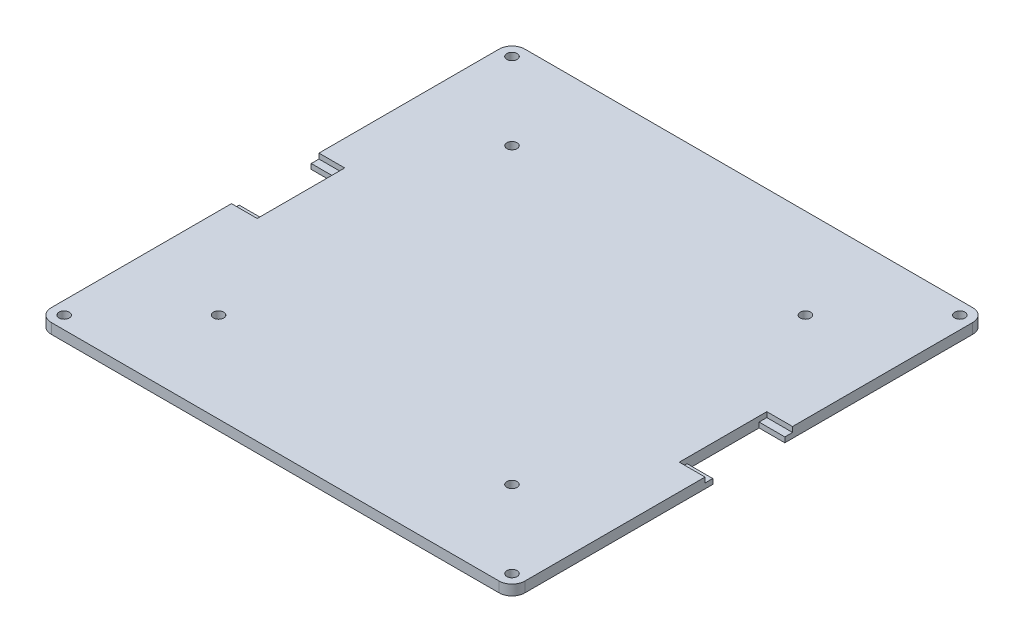
ISO-10303-21;
HEADER;
FILE_DESCRIPTION(('STEP AP214'),'2;1');
FILE_NAME('part.step','',(''),(''),'','','');
FILE_SCHEMA(('AUTOMOTIVE_DESIGN { 1 0 10303 214 1 1 1 1 }'));
ENDSEC;
DATA;
#1=APPLICATION_CONTEXT('core data for automotive mechanical design processes');
#2=APPLICATION_PROTOCOL_DEFINITION('international standard','automotive_design',2000,#1);
#3=PRODUCT_CONTEXT('',#1,'mechanical');
#4=PRODUCT('Part','Part','',(#3));
#5=PRODUCT_RELATED_PRODUCT_CATEGORY('part','',(#4));
#6=PRODUCT_DEFINITION_FORMATION('','',#4);
#7=PRODUCT_DEFINITION_CONTEXT('part definition',#1,'design');
#8=PRODUCT_DEFINITION('design','',#6,#7);
#9=PRODUCT_DEFINITION_SHAPE('','',#8);
#10=(LENGTH_UNIT() NAMED_UNIT(*) SI_UNIT(.MILLI.,.METRE.));
#11=(NAMED_UNIT(*) PLANE_ANGLE_UNIT() SI_UNIT($,.RADIAN.));
#12=(NAMED_UNIT(*) SI_UNIT($,.STERADIAN.) SOLID_ANGLE_UNIT());
#13=UNCERTAINTY_MEASURE_WITH_UNIT(LENGTH_MEASURE(1.E-05),#10,'distance_accuracy_value','');
#14=(GEOMETRIC_REPRESENTATION_CONTEXT(3) GLOBAL_UNCERTAINTY_ASSIGNED_CONTEXT((#13)) GLOBAL_UNIT_ASSIGNED_CONTEXT((#10,
#11,#12)) REPRESENTATION_CONTEXT('',''));
#15=CARTESIAN_POINT('',(0.,0.,0.));
#16=DIRECTION('',(0.,0.,1.));
#17=DIRECTION('',(1.,0.,0.));
#18=AXIS2_PLACEMENT_3D('',#15,#16,#17);
#19=CARTESIAN_POINT('',(-46.,-8.,-6.99999999999999));
#20=DIRECTION('',(0.,0.,-1.));
#21=DIRECTION('',(-1.,0.,0.));
#22=AXIS2_PLACEMENT_3D('',#19,#20,#21);
#23=PLANE('',#22);
#24=DIRECTION('',(-1.,0.,0.));
#25=VECTOR('',#24,1.);
#26=CARTESIAN_POINT('',(-41.,-9.,-6.99999999999999));
#27=LINE('',#26,#25);
#28=CARTESIAN_POINT('',(-41.,-9.,-6.99999999999999));
#29=VERTEX_POINT('',#28);
#30=CARTESIAN_POINT('',(-46.,-9.,-6.99999999999999));
#31=VERTEX_POINT('',#30);
#32=EDGE_CURVE('E271',#29,#31,#27,.T.);
#33=ORIENTED_EDGE('',*,*,#32,.T.);
#34=DIRECTION('',(0.,-1.,0.));
#35=VECTOR('',#34,1.);
#36=CARTESIAN_POINT('',(-46.,-8.,-6.99999999999999));
#37=LINE('',#36,#35);
#38=CARTESIAN_POINT('',(-46.,-10.,-6.99999999999999));
#39=VERTEX_POINT('',#38);
#40=EDGE_CURVE('E12',#31,#39,#37,.T.);
#41=ORIENTED_EDGE('',*,*,#40,.T.);
#42=DIRECTION('',(1.,0.,0.));
#43=VECTOR('',#42,1.);
#44=CARTESIAN_POINT('',(-46.,-10.,-6.99999999999999));
#45=LINE('',#44,#43);
#46=CARTESIAN_POINT('',(-41.,-10.,-6.99999999999999));
#47=VERTEX_POINT('',#46);
#48=EDGE_CURVE('E313',#39,#47,#45,.T.);
#49=ORIENTED_EDGE('',*,*,#48,.T.);
#50=DIRECTION('',(0.,-1.,0.));
#51=VECTOR('',#50,1.);
#52=CARTESIAN_POINT('',(-41.,-8.,-6.99999999999999));
#53=LINE('',#52,#51);
#54=EDGE_CURVE('E50',#29,#47,#53,.T.);
#55=ORIENTED_EDGE('',*,*,#54,.F.);
#56=EDGE_LOOP('',(#33,#41,#49,#55));
#57=FACE_BOUND('',#56,.T.);
#58=ADVANCED_FACE('F41',(#57),#23,.F.);
#59=CARTESIAN_POINT('',(-41.,-8.,7.00000000000001));
#60=DIRECTION('',(0.,0.,1.));
#61=DIRECTION('',(1.,0.,0.));
#62=AXIS2_PLACEMENT_3D('',#59,#60,#61);
#63=PLANE('',#62);
#64=DIRECTION('',(1.,0.,0.));
#65=VECTOR('',#64,1.);
#66=CARTESIAN_POINT('',(-41.,-9.,7.00000000000001));
#67=LINE('',#66,#65);
#68=CARTESIAN_POINT('',(-46.,-9.,7.00000000000001));
#69=VERTEX_POINT('',#68);
#70=CARTESIAN_POINT('',(-41.,-9.,7.00000000000001));
#71=VERTEX_POINT('',#70);
#72=EDGE_CURVE('E214',#69,#71,#67,.T.);
#73=ORIENTED_EDGE('',*,*,#72,.T.);
#74=DIRECTION('',(0.,-1.,0.));
#75=VECTOR('',#74,1.);
#76=CARTESIAN_POINT('',(-41.,-8.,7.00000000000001));
#77=LINE('',#76,#75);
#78=CARTESIAN_POINT('',(-41.,-10.,7.00000000000001));
#79=VERTEX_POINT('',#78);
#80=EDGE_CURVE('E210',#71,#79,#77,.T.);
#81=ORIENTED_EDGE('',*,*,#80,.T.);
#82=DIRECTION('',(-1.,0.,0.));
#83=VECTOR('',#82,1.);
#84=CARTESIAN_POINT('',(-41.,-10.,7.00000000000001));
#85=LINE('',#84,#83);
#86=CARTESIAN_POINT('',(-46.,-10.,7.00000000000001));
#87=VERTEX_POINT('',#86);
#88=EDGE_CURVE('E318',#79,#87,#85,.T.);
#89=ORIENTED_EDGE('',*,*,#88,.T.);
#90=DIRECTION('',(0.,-1.,0.));
#91=VECTOR('',#90,1.);
#92=CARTESIAN_POINT('',(-46.,-8.,7.00000000000001));
#93=LINE('',#92,#91);
#94=EDGE_CURVE('E379',#69,#87,#93,.T.);
#95=ORIENTED_EDGE('',*,*,#94,.F.);
#96=EDGE_LOOP('',(#73,#81,#89,#95));
#97=FACE_BOUND('',#96,.T.);
#98=ADVANCED_FACE('F424',(#97),#63,.F.);
#99=CARTESIAN_POINT('',(41.,-8.,7.00000000000001));
#100=DIRECTION('',(0.,0.,1.));
#101=DIRECTION('',(1.,0.,0.));
#102=AXIS2_PLACEMENT_3D('',#99,#100,#101);
#103=PLANE('',#102);
#104=DIRECTION('',(1.,0.,0.));
#105=VECTOR('',#104,1.);
#106=CARTESIAN_POINT('',(41.,-9.,7.00000000000001));
#107=LINE('',#106,#105);
#108=CARTESIAN_POINT('',(41.,-9.,7.00000000000001));
#109=VERTEX_POINT('',#108);
#110=CARTESIAN_POINT('',(46.,-9.,7.00000000000001));
#111=VERTEX_POINT('',#110);
#112=EDGE_CURVE('E247',#109,#111,#107,.T.);
#113=ORIENTED_EDGE('',*,*,#112,.T.);
#114=DIRECTION('',(0.,-1.,0.));
#115=VECTOR('',#114,1.);
#116=CARTESIAN_POINT('',(46.,-8.,7.00000000000001));
#117=LINE('',#116,#115);
#118=CARTESIAN_POINT('',(46.,-10.,7.00000000000001));
#119=VERTEX_POINT('',#118);
#120=EDGE_CURVE('E365',#111,#119,#117,.T.);
#121=ORIENTED_EDGE('',*,*,#120,.T.);
#122=DIRECTION('',(-1.,0.,0.));
#123=VECTOR('',#122,1.);
#124=CARTESIAN_POINT('',(41.,-10.,7.00000000000001));
#125=LINE('',#124,#123);
#126=CARTESIAN_POINT('',(41.,-10.,7.00000000000001));
#127=VERTEX_POINT('',#126);
#128=EDGE_CURVE('E332',#119,#127,#125,.T.);
#129=ORIENTED_EDGE('',*,*,#128,.T.);
#130=DIRECTION('',(0.,-1.,0.));
#131=VECTOR('',#130,1.);
#132=CARTESIAN_POINT('',(41.,-8.,7.00000000000001));
#133=LINE('',#132,#131);
#134=EDGE_CURVE('E363',#109,#127,#133,.T.);
#135=ORIENTED_EDGE('',*,*,#134,.F.);
#136=EDGE_LOOP('',(#113,#121,#129,#135));
#137=FACE_BOUND('',#136,.T.);
#138=ADVANCED_FACE('F430',(#137),#103,.F.);
#139=CARTESIAN_POINT('',(46.,-8.,-6.99999999999999));
#140=DIRECTION('',(0.,0.,-1.));
#141=DIRECTION('',(-1.,0.,0.));
#142=AXIS2_PLACEMENT_3D('',#139,#140,#141);
#143=PLANE('',#142);
#144=DIRECTION('',(-1.,0.,0.));
#145=VECTOR('',#144,1.);
#146=CARTESIAN_POINT('',(41.,-9.,-6.99999999999999));
#147=LINE('',#146,#145);
#148=CARTESIAN_POINT('',(46.,-9.,-6.99999999999999));
#149=VERTEX_POINT('',#148);
#150=CARTESIAN_POINT('',(41.,-9.,-6.99999999999999));
#151=VERTEX_POINT('',#150);
#152=EDGE_CURVE('E252',#149,#151,#147,.T.);
#153=ORIENTED_EDGE('',*,*,#152,.T.);
#154=DIRECTION('',(0.,-1.,0.));
#155=VECTOR('',#154,1.);
#156=CARTESIAN_POINT('',(41.,-8.,-6.99999999999999));
#157=LINE('',#156,#155);
#158=CARTESIAN_POINT('',(41.,-10.,-6.99999999999999));
#159=VERTEX_POINT('',#158);
#160=EDGE_CURVE('E361',#151,#159,#157,.T.);
#161=ORIENTED_EDGE('',*,*,#160,.T.);
#162=DIRECTION('',(1.,0.,0.));
#163=VECTOR('',#162,1.);
#164=CARTESIAN_POINT('',(46.,-10.,-6.99999999999999));
#165=LINE('',#164,#163);
#166=CARTESIAN_POINT('',(46.,-10.,-6.99999999999999));
#167=VERTEX_POINT('',#166);
#168=EDGE_CURVE('E338',#159,#167,#165,.T.);
#169=ORIENTED_EDGE('',*,*,#168,.T.);
#170=DIRECTION('',(0.,-1.,0.));
#171=VECTOR('',#170,1.);
#172=CARTESIAN_POINT('',(46.,-8.,-6.99999999999999));
#173=LINE('',#172,#171);
#174=EDGE_CURVE('E359',#149,#167,#173,.T.);
#175=ORIENTED_EDGE('',*,*,#174,.F.);
#176=EDGE_LOOP('',(#153,#161,#169,#175));
#177=FACE_BOUND('',#176,.T.);
#178=ADVANCED_FACE('F459',(#177),#143,.F.);
#179=CARTESIAN_POINT('',(-46.,-8.,-43.5));
#180=DIRECTION('',(1.,0.,0.));
#181=DIRECTION('',(0.,0.,-1.));
#182=AXIS2_PLACEMENT_3D('',#179,#180,#181);
#183=PLANE('',#182);
#184=DIRECTION('',(0.,0.,-1.));
#185=VECTOR('',#184,1.);
#186=CARTESIAN_POINT('',(-46.,-9.,-6.99999999999999));
#187=LINE('',#186,#185);
#188=CARTESIAN_POINT('',(-46.,-9.,-8.49999999999999));
#189=VERTEX_POINT('',#188);
#190=EDGE_CURVE('E268',#31,#189,#187,.T.);
#191=ORIENTED_EDGE('',*,*,#190,.T.);
#192=DIRECTION('',(0.,1.,0.));
#193=VECTOR('',#192,1.);
#194=CARTESIAN_POINT('',(-46.,-15.2201532544553,-8.49999999999999));
#195=LINE('',#194,#193);
#196=CARTESIAN_POINT('',(-46.,-8.,-8.49999999999999));
#197=VERTEX_POINT('',#196);
#198=EDGE_CURVE('E272',#189,#197,#195,.T.);
#199=ORIENTED_EDGE('',*,*,#198,.T.);
#200=DIRECTION('',(0.,0.,1.));
#201=VECTOR('',#200,1.);
#202=CARTESIAN_POINT('',(-46.,-8.,-43.5));
#203=LINE('',#202,#201);
#204=CARTESIAN_POINT('',(-46.,-8.,-43.5));
#205=VERTEX_POINT('',#204);
#206=EDGE_CURVE('E285',#205,#197,#203,.T.);
#207=ORIENTED_EDGE('',*,*,#206,.F.);
#208=DIRECTION('',(0.,-1.,0.));
#209=VECTOR('',#208,1.);
#210=CARTESIAN_POINT('',(-46.,-8.,-43.5));
#211=LINE('',#210,#209);
#212=CARTESIAN_POINT('',(-46.,-10.,-43.5));
#213=VERTEX_POINT('',#212);
#214=EDGE_CURVE('E310',#205,#213,#211,.T.);
#215=ORIENTED_EDGE('',*,*,#214,.T.);
#216=DIRECTION('',(0.,0.,1.));
#217=VECTOR('',#216,1.);
#218=CARTESIAN_POINT('',(-46.,-10.,-43.5));
#219=LINE('',#218,#217);
#220=EDGE_CURVE('E284',#213,#39,#219,.T.);
#221=ORIENTED_EDGE('',*,*,#220,.T.);
#222=ORIENTED_EDGE('',*,*,#40,.F.);
#223=EDGE_LOOP('',(#191,#199,#207,#215,#221,#222));
#224=FACE_BOUND('',#223,.T.);
#225=ADVANCED_FACE('F43',(#224),#183,.F.);
#226=CARTESIAN_POINT('',(-41.,-8.,-6.99999999999999));
#227=DIRECTION('',(1.,0.,0.));
#228=DIRECTION('',(0.,0.,-1.));
#229=AXIS2_PLACEMENT_3D('',#226,#227,#228);
#230=PLANE('',#229);
#231=DIRECTION('',(0.,0.,1.));
#232=VECTOR('',#231,1.);
#233=CARTESIAN_POINT('',(-41.,-10.,-6.99999999999999));
#234=LINE('',#233,#232);
#235=EDGE_CURVE('E316',#47,#79,#234,.T.);
#236=ORIENTED_EDGE('',*,*,#235,.T.);
#237=ORIENTED_EDGE('',*,*,#80,.F.);
#238=DIRECTION('',(0.,0.,1.));
#239=VECTOR('',#238,1.);
#240=CARTESIAN_POINT('',(-41.,-9.,7.00000000000001));
#241=LINE('',#240,#239);
#242=CARTESIAN_POINT('',(-41.,-9.,8.50000000000001));
#243=VERTEX_POINT('',#242);
#244=EDGE_CURVE('E203',#71,#243,#241,.T.);
#245=ORIENTED_EDGE('',*,*,#244,.T.);
#246=DIRECTION('',(0.,1.,0.));
#247=VECTOR('',#246,1.);
#248=CARTESIAN_POINT('',(-41.,-15.2201532544553,8.50000000000001));
#249=LINE('',#248,#247);
#250=CARTESIAN_POINT('',(-41.,-8.,8.50000000000001));
#251=VERTEX_POINT('',#250);
#252=EDGE_CURVE('E208',#243,#251,#249,.T.);
#253=ORIENTED_EDGE('',*,*,#252,.T.);
#254=DIRECTION('',(0.,0.,1.));
#255=VECTOR('',#254,1.);
#256=CARTESIAN_POINT('',(-41.,-8.,-6.99999999999999));
#257=LINE('',#256,#255);
#258=CARTESIAN_POINT('',(-41.,-8.,-8.49999999999999));
#259=VERTEX_POINT('',#258);
#260=EDGE_CURVE('E66',#259,#251,#257,.T.);
#261=ORIENTED_EDGE('',*,*,#260,.F.);
#262=DIRECTION('',(0.,1.,0.));
#263=VECTOR('',#262,1.);
#264=CARTESIAN_POINT('',(-41.,-15.2201532544553,-8.49999999999999));
#265=LINE('',#264,#263);
#266=CARTESIAN_POINT('',(-41.,-9.,-8.49999999999999));
#267=VERTEX_POINT('',#266);
#268=EDGE_CURVE('E279',#267,#259,#265,.T.);
#269=ORIENTED_EDGE('',*,*,#268,.F.);
#270=DIRECTION('',(0.,0.,1.));
#271=VECTOR('',#270,1.);
#272=CARTESIAN_POINT('',(-41.,-9.,-6.99999999999999));
#273=LINE('',#272,#271);
#274=EDGE_CURVE('E275',#267,#29,#273,.T.);
#275=ORIENTED_EDGE('',*,*,#274,.T.);
#276=ORIENTED_EDGE('',*,*,#54,.T.);
#277=EDGE_LOOP('',(#236,#237,#245,#253,#261,#269,#275,#276));
#278=FACE_BOUND('',#277,.T.);
#279=ADVANCED_FACE('F206',(#278),#230,.F.);
#280=CARTESIAN_POINT('',(-46.,-8.,7.00000000000001));
#281=DIRECTION('',(1.,0.,0.));
#282=DIRECTION('',(0.,0.,-1.));
#283=AXIS2_PLACEMENT_3D('',#280,#281,#282);
#284=PLANE('',#283);
#285=DIRECTION('',(0.,0.,1.));
#286=VECTOR('',#285,1.);
#287=CARTESIAN_POINT('',(-46.,-8.,7.00000000000001));
#288=LINE('',#287,#286);
#289=CARTESIAN_POINT('',(-46.,-8.,8.50000000000001));
#290=VERTEX_POINT('',#289);
#291=CARTESIAN_POINT('',(-46.,-8.,43.5));
#292=VERTEX_POINT('',#291);
#293=EDGE_CURVE('E290',#290,#292,#288,.T.);
#294=ORIENTED_EDGE('',*,*,#293,.F.);
#295=DIRECTION('',(0.,1.,0.));
#296=VECTOR('',#295,1.);
#297=CARTESIAN_POINT('',(-46.,-15.2201532544553,8.50000000000001));
#298=LINE('',#297,#296);
#299=CARTESIAN_POINT('',(-46.,-9.,8.50000000000001));
#300=VERTEX_POINT('',#299);
#301=EDGE_CURVE('E226',#300,#290,#298,.T.);
#302=ORIENTED_EDGE('',*,*,#301,.F.);
#303=DIRECTION('',(0.,0.,-1.));
#304=VECTOR('',#303,1.);
#305=CARTESIAN_POINT('',(-46.,-9.,7.00000000000001));
#306=LINE('',#305,#304);
#307=EDGE_CURVE('E219',#300,#69,#306,.T.);
#308=ORIENTED_EDGE('',*,*,#307,.T.);
#309=ORIENTED_EDGE('',*,*,#94,.T.);
#310=DIRECTION('',(0.,0.,1.));
#311=VECTOR('',#310,1.);
#312=CARTESIAN_POINT('',(-46.,-10.,7.00000000000001));
#313=LINE('',#312,#311);
#314=CARTESIAN_POINT('',(-46.,-10.,43.5));
#315=VERTEX_POINT('',#314);
#316=EDGE_CURVE('E321',#87,#315,#313,.T.);
#317=ORIENTED_EDGE('',*,*,#316,.T.);
#318=DIRECTION('',(0.,-1.,0.));
#319=VECTOR('',#318,1.);
#320=CARTESIAN_POINT('',(-46.,-8.,43.5));
#321=LINE('',#320,#319);
#322=EDGE_CURVE('E376',#292,#315,#321,.T.);
#323=ORIENTED_EDGE('',*,*,#322,.F.);
#324=EDGE_LOOP('',(#294,#302,#308,#309,#317,#323));
#325=FACE_BOUND('',#324,.T.);
#326=ADVANCED_FACE('F435',(#325),#284,.F.);
#327=CARTESIAN_POINT('',(-43.5,-8.,43.5));
#328=DIRECTION('',(0.,-1.,0.));
#329=DIRECTION('',(0.,0.,-1.));
#330=AXIS2_PLACEMENT_3D('',#327,#328,#329);
#331=CYLINDRICAL_SURFACE('',#330,2.50000000000001);
#332=CARTESIAN_POINT('',(-43.5,-10.,43.5));
#333=DIRECTION('',(0.,1.,0.));
#334=DIRECTION('',(0.,0.,1.));
#335=AXIS2_PLACEMENT_3D('',#332,#333,#334);
#336=CIRCLE('',#335,2.50000000000001);
#337=CARTESIAN_POINT('',(-43.5,-10.,46.));
#338=VERTEX_POINT('',#337);
#339=EDGE_CURVE('E323',#315,#338,#336,.T.);
#340=ORIENTED_EDGE('',*,*,#339,.T.);
#341=DIRECTION('',(0.,-1.,0.));
#342=VECTOR('',#341,1.);
#343=CARTESIAN_POINT('',(-43.5,-8.,46.));
#344=LINE('',#343,#342);
#345=CARTESIAN_POINT('',(-43.5,-8.,46.));
#346=VERTEX_POINT('',#345);
#347=EDGE_CURVE('E373',#346,#338,#344,.T.);
#348=ORIENTED_EDGE('',*,*,#347,.F.);
#349=CARTESIAN_POINT('',(-43.5,-8.,43.5));
#350=DIRECTION('',(0.,1.,0.));
#351=DIRECTION('',(0.,0.,1.));
#352=AXIS2_PLACEMENT_3D('',#349,#350,#351);
#353=CIRCLE('',#352,2.50000000000001);
#354=EDGE_CURVE('E292',#292,#346,#353,.T.);
#355=ORIENTED_EDGE('',*,*,#354,.F.);
#356=ORIENTED_EDGE('',*,*,#322,.T.);
#357=EDGE_LOOP('',(#340,#348,#355,#356));
#358=FACE_BOUND('',#357,.T.);
#359=ADVANCED_FACE('F439',(#358),#331,.T.);
#360=CARTESIAN_POINT('',(-43.5,-8.,46.));
#361=DIRECTION('',(0.,0.,-1.));
#362=DIRECTION('',(-1.,0.,0.));
#363=AXIS2_PLACEMENT_3D('',#360,#361,#362);
#364=PLANE('',#363);
#365=DIRECTION('',(1.,0.,0.));
#366=VECTOR('',#365,1.);
#367=CARTESIAN_POINT('',(-43.5,-10.,46.));
#368=LINE('',#367,#366);
#369=CARTESIAN_POINT('',(43.5,-10.,46.));
#370=VERTEX_POINT('',#369);
#371=EDGE_CURVE('E325',#338,#370,#368,.T.);
#372=ORIENTED_EDGE('',*,*,#371,.T.);
#373=DIRECTION('',(0.,-1.,0.));
#374=VECTOR('',#373,1.);
#375=CARTESIAN_POINT('',(43.5,-8.,46.));
#376=LINE('',#375,#374);
#377=CARTESIAN_POINT('',(43.5,-8.,46.));
#378=VERTEX_POINT('',#377);
#379=EDGE_CURVE('E370',#378,#370,#376,.T.);
#380=ORIENTED_EDGE('',*,*,#379,.F.);
#381=DIRECTION('',(1.,0.,0.));
#382=VECTOR('',#381,1.);
#383=CARTESIAN_POINT('',(-43.5,-8.,46.));
#384=LINE('',#383,#382);
#385=EDGE_CURVE('E294',#346,#378,#384,.T.);
#386=ORIENTED_EDGE('',*,*,#385,.F.);
#387=ORIENTED_EDGE('',*,*,#347,.T.);
#388=EDGE_LOOP('',(#372,#380,#386,#387));
#389=FACE_BOUND('',#388,.T.);
#390=ADVANCED_FACE('F443',(#389),#364,.F.);
#391=CARTESIAN_POINT('',(43.5,-8.,43.5));
#392=DIRECTION('',(0.,-1.,0.));
#393=DIRECTION('',(0.,0.,-1.));
#394=AXIS2_PLACEMENT_3D('',#391,#392,#393);
#395=CYLINDRICAL_SURFACE('',#394,2.5);
#396=CARTESIAN_POINT('',(43.5,-10.,43.5));
#397=DIRECTION('',(0.,1.,0.));
#398=DIRECTION('',(0.,0.,1.));
#399=AXIS2_PLACEMENT_3D('',#396,#397,#398);
#400=CIRCLE('',#399,2.5);
#401=CARTESIAN_POINT('',(46.,-10.,43.5));
#402=VERTEX_POINT('',#401);
#403=EDGE_CURVE('E327',#370,#402,#400,.T.);
#404=ORIENTED_EDGE('',*,*,#403,.T.);
#405=DIRECTION('',(0.,-1.,0.));
#406=VECTOR('',#405,1.);
#407=CARTESIAN_POINT('',(46.,-8.,43.5));
#408=LINE('',#407,#406);
#409=CARTESIAN_POINT('',(46.,-8.,43.5));
#410=VERTEX_POINT('',#409);
#411=EDGE_CURVE('E367',#410,#402,#408,.T.);
#412=ORIENTED_EDGE('',*,*,#411,.F.);
#413=CARTESIAN_POINT('',(43.5,-8.,43.5));
#414=DIRECTION('',(0.,1.,0.));
#415=DIRECTION('',(0.,0.,1.));
#416=AXIS2_PLACEMENT_3D('',#413,#414,#415);
#417=CIRCLE('',#416,2.5);
#418=EDGE_CURVE('E296',#378,#410,#417,.T.);
#419=ORIENTED_EDGE('',*,*,#418,.F.);
#420=ORIENTED_EDGE('',*,*,#379,.T.);
#421=EDGE_LOOP('',(#404,#412,#419,#420));
#422=FACE_BOUND('',#421,.T.);
#423=ADVANCED_FACE('F447',(#422),#395,.T.);
#424=CARTESIAN_POINT('',(46.,-8.,43.5));
#425=DIRECTION('',(-1.,0.,0.));
#426=DIRECTION('',(0.,0.,1.));
#427=AXIS2_PLACEMENT_3D('',#424,#425,#426);
#428=PLANE('',#427);
#429=DIRECTION('',(0.,0.,1.));
#430=VECTOR('',#429,1.);
#431=CARTESIAN_POINT('',(46.,-9.,7.00000000000001));
#432=LINE('',#431,#430);
#433=CARTESIAN_POINT('',(46.,-9.,8.50000000000001));
#434=VERTEX_POINT('',#433);
#435=EDGE_CURVE('E244',#111,#434,#432,.T.);
#436=ORIENTED_EDGE('',*,*,#435,.T.);
#437=DIRECTION('',(0.,1.,0.));
#438=VECTOR('',#437,1.);
#439=CARTESIAN_POINT('',(46.,-15.2201532544553,8.50000000000001));
#440=LINE('',#439,#438);
#441=CARTESIAN_POINT('',(46.,-8.,8.50000000000001));
#442=VERTEX_POINT('',#441);
#443=EDGE_CURVE('E241',#434,#442,#440,.T.);
#444=ORIENTED_EDGE('',*,*,#443,.T.);
#445=DIRECTION('',(0.,0.,-1.));
#446=VECTOR('',#445,1.);
#447=CARTESIAN_POINT('',(46.,-8.,43.5));
#448=LINE('',#447,#446);
#449=EDGE_CURVE('E298',#410,#442,#448,.T.);
#450=ORIENTED_EDGE('',*,*,#449,.F.);
#451=ORIENTED_EDGE('',*,*,#411,.T.);
#452=DIRECTION('',(0.,0.,-1.));
#453=VECTOR('',#452,1.);
#454=CARTESIAN_POINT('',(46.,-10.,43.5));
#455=LINE('',#454,#453);
#456=EDGE_CURVE('E329',#402,#119,#455,.T.);
#457=ORIENTED_EDGE('',*,*,#456,.T.);
#458=ORIENTED_EDGE('',*,*,#120,.F.);
#459=EDGE_LOOP('',(#436,#444,#450,#451,#457,#458));
#460=FACE_BOUND('',#459,.T.);
#461=ADVANCED_FACE('F451',(#460),#428,.F.);
#462=CARTESIAN_POINT('',(41.,-8.,-6.99999999999999));
#463=DIRECTION('',(-1.,0.,0.));
#464=DIRECTION('',(0.,0.,1.));
#465=AXIS2_PLACEMENT_3D('',#462,#463,#464);
#466=PLANE('',#465);
#467=DIRECTION('',(0.,0.,-1.));
#468=VECTOR('',#467,1.);
#469=CARTESIAN_POINT('',(41.,-10.,-6.99999999999999));
#470=LINE('',#469,#468);
#471=EDGE_CURVE('E335',#127,#159,#470,.T.);
#472=ORIENTED_EDGE('',*,*,#471,.T.);
#473=ORIENTED_EDGE('',*,*,#160,.F.);
#474=DIRECTION('',(0.,0.,-1.));
#475=VECTOR('',#474,1.);
#476=CARTESIAN_POINT('',(41.,-9.,-6.99999999999999));
#477=LINE('',#476,#475);
#478=CARTESIAN_POINT('',(41.,-9.,-8.49999999999999));
#479=VERTEX_POINT('',#478);
#480=EDGE_CURVE('E255',#151,#479,#477,.T.);
#481=ORIENTED_EDGE('',*,*,#480,.T.);
#482=DIRECTION('',(0.,1.,0.));
#483=VECTOR('',#482,1.);
#484=CARTESIAN_POINT('',(41.,-15.2201532544553,-8.49999999999999));
#485=LINE('',#484,#483);
#486=CARTESIAN_POINT('',(41.,-8.,-8.49999999999999));
#487=VERTEX_POINT('',#486);
#488=EDGE_CURVE('E258',#479,#487,#485,.T.);
#489=ORIENTED_EDGE('',*,*,#488,.T.);
#490=DIRECTION('',(0.,0.,-1.));
#491=VECTOR('',#490,1.);
#492=CARTESIAN_POINT('',(41.,-8.,-6.99999999999999));
#493=LINE('',#492,#491);
#494=CARTESIAN_POINT('',(41.,-8.,8.50000000000001));
#495=VERTEX_POINT('',#494);
#496=EDGE_CURVE('E58',#495,#487,#493,.T.);
#497=ORIENTED_EDGE('',*,*,#496,.F.);
#498=DIRECTION('',(0.,1.,0.));
#499=VECTOR('',#498,1.);
#500=CARTESIAN_POINT('',(41.,-15.2201532544553,8.50000000000001));
#501=LINE('',#500,#499);
#502=CARTESIAN_POINT('',(41.,-9.,8.50000000000001));
#503=VERTEX_POINT('',#502);
#504=EDGE_CURVE('E238',#503,#495,#501,.T.);
#505=ORIENTED_EDGE('',*,*,#504,.F.);
#506=DIRECTION('',(0.,0.,-1.));
#507=VECTOR('',#506,1.);
#508=CARTESIAN_POINT('',(41.,-9.,7.00000000000001));
#509=LINE('',#508,#507);
#510=EDGE_CURVE('E236',#503,#109,#509,.T.);
#511=ORIENTED_EDGE('',*,*,#510,.T.);
#512=ORIENTED_EDGE('',*,*,#134,.T.);
#513=EDGE_LOOP('',(#472,#473,#481,#489,#497,#505,#511,#512));
#514=FACE_BOUND('',#513,.T.);
#515=ADVANCED_FACE('F455',(#514),#466,.F.);
#516=CARTESIAN_POINT('',(46.,-8.,-6.99999999999999));
#517=DIRECTION('',(-1.,0.,0.));
#518=DIRECTION('',(0.,0.,1.));
#519=AXIS2_PLACEMENT_3D('',#516,#517,#518);
#520=PLANE('',#519);
#521=DIRECTION('',(0.,0.,-1.));
#522=VECTOR('',#521,1.);
#523=CARTESIAN_POINT('',(46.,-8.,-6.99999999999999));
#524=LINE('',#523,#522);
#525=CARTESIAN_POINT('',(46.,-8.,-8.49999999999999));
#526=VERTEX_POINT('',#525);
#527=CARTESIAN_POINT('',(46.,-8.,-43.5));
#528=VERTEX_POINT('',#527);
#529=EDGE_CURVE('E302',#526,#528,#524,.T.);
#530=ORIENTED_EDGE('',*,*,#529,.F.);
#531=DIRECTION('',(0.,1.,0.));
#532=VECTOR('',#531,1.);
#533=CARTESIAN_POINT('',(46.,-15.2201532544553,-8.49999999999999));
#534=LINE('',#533,#532);
#535=CARTESIAN_POINT('',(46.,-9.,-8.49999999999999));
#536=VERTEX_POINT('',#535);
#537=EDGE_CURVE('E256',#536,#526,#534,.T.);
#538=ORIENTED_EDGE('',*,*,#537,.F.);
#539=DIRECTION('',(0.,0.,1.));
#540=VECTOR('',#539,1.);
#541=CARTESIAN_POINT('',(46.,-9.,-6.99999999999999));
#542=LINE('',#541,#540);
#543=EDGE_CURVE('E260',#536,#149,#542,.T.);
#544=ORIENTED_EDGE('',*,*,#543,.T.);
#545=ORIENTED_EDGE('',*,*,#174,.T.);
#546=DIRECTION('',(0.,0.,-1.));
#547=VECTOR('',#546,1.);
#548=CARTESIAN_POINT('',(46.,-10.,-6.99999999999999));
#549=LINE('',#548,#547);
#550=CARTESIAN_POINT('',(46.,-10.,-43.5));
#551=VERTEX_POINT('',#550);
#552=EDGE_CURVE('E341',#167,#551,#549,.T.);
#553=ORIENTED_EDGE('',*,*,#552,.T.);
#554=DIRECTION('',(0.,-1.,0.));
#555=VECTOR('',#554,1.);
#556=CARTESIAN_POINT('',(46.,-8.,-43.5));
#557=LINE('',#556,#555);
#558=EDGE_CURVE('E356',#528,#551,#557,.T.);
#559=ORIENTED_EDGE('',*,*,#558,.F.);
#560=EDGE_LOOP('',(#530,#538,#544,#545,#553,#559));
#561=FACE_BOUND('',#560,.T.);
#562=ADVANCED_FACE('F463',(#561),#520,.F.);
#563=CARTESIAN_POINT('',(43.5,-8.,-43.5));
#564=DIRECTION('',(0.,-1.,0.));
#565=DIRECTION('',(0.,0.,-1.));
#566=AXIS2_PLACEMENT_3D('',#563,#564,#565);
#567=CYLINDRICAL_SURFACE('',#566,2.49999999999999);
#568=CARTESIAN_POINT('',(43.5,-10.,-43.5));
#569=DIRECTION('',(0.,1.,0.));
#570=DIRECTION('',(0.,0.,1.));
#571=AXIS2_PLACEMENT_3D('',#568,#569,#570);
#572=CIRCLE('',#571,2.49999999999999);
#573=CARTESIAN_POINT('',(43.5,-10.,-46.));
#574=VERTEX_POINT('',#573);
#575=EDGE_CURVE('E343',#551,#574,#572,.T.);
#576=ORIENTED_EDGE('',*,*,#575,.T.);
#577=DIRECTION('',(0.,-1.,0.));
#578=VECTOR('',#577,1.);
#579=CARTESIAN_POINT('',(43.5,-8.,-46.));
#580=LINE('',#579,#578);
#581=CARTESIAN_POINT('',(43.5,-8.,-46.));
#582=VERTEX_POINT('',#581);
#583=EDGE_CURVE('E353',#582,#574,#580,.T.);
#584=ORIENTED_EDGE('',*,*,#583,.F.);
#585=CARTESIAN_POINT('',(43.5,-8.,-43.5));
#586=DIRECTION('',(0.,1.,0.));
#587=DIRECTION('',(0.,0.,1.));
#588=AXIS2_PLACEMENT_3D('',#585,#586,#587);
#589=CIRCLE('',#588,2.49999999999999);
#590=EDGE_CURVE('E304',#528,#582,#589,.T.);
#591=ORIENTED_EDGE('',*,*,#590,.F.);
#592=ORIENTED_EDGE('',*,*,#558,.T.);
#593=EDGE_LOOP('',(#576,#584,#591,#592));
#594=FACE_BOUND('',#593,.T.);
#595=ADVANCED_FACE('F469',(#594),#567,.T.);
#596=CARTESIAN_POINT('',(43.5,-8.,-46.));
#597=DIRECTION('',(0.,0.,1.));
#598=DIRECTION('',(1.,0.,0.));
#599=AXIS2_PLACEMENT_3D('',#596,#597,#598);
#600=PLANE('',#599);
#601=DIRECTION('',(-1.,0.,0.));
#602=VECTOR('',#601,1.);
#603=CARTESIAN_POINT('',(43.5,-10.,-46.));
#604=LINE('',#603,#602);
#605=CARTESIAN_POINT('',(-43.5,-10.,-46.));
#606=VERTEX_POINT('',#605);
#607=EDGE_CURVE('E345',#574,#606,#604,.T.);
#608=ORIENTED_EDGE('',*,*,#607,.T.);
#609=DIRECTION('',(0.,-1.,0.));
#610=VECTOR('',#609,1.);
#611=CARTESIAN_POINT('',(-43.5,-8.,-46.));
#612=LINE('',#611,#610);
#613=CARTESIAN_POINT('',(-43.5,-8.,-46.));
#614=VERTEX_POINT('',#613);
#615=EDGE_CURVE('E350',#614,#606,#612,.T.);
#616=ORIENTED_EDGE('',*,*,#615,.F.);
#617=DIRECTION('',(-1.,0.,0.));
#618=VECTOR('',#617,1.);
#619=CARTESIAN_POINT('',(43.5,-8.,-46.));
#620=LINE('',#619,#618);
#621=EDGE_CURVE('E306',#582,#614,#620,.T.);
#622=ORIENTED_EDGE('',*,*,#621,.F.);
#623=ORIENTED_EDGE('',*,*,#583,.T.);
#624=EDGE_LOOP('',(#608,#616,#622,#623));
#625=FACE_BOUND('',#624,.T.);
#626=ADVANCED_FACE('F473',(#625),#600,.F.);
#627=CARTESIAN_POINT('',(-43.5,-8.,-43.5));
#628=DIRECTION('',(0.,-1.,0.));
#629=DIRECTION('',(0.,0.,-1.));
#630=AXIS2_PLACEMENT_3D('',#627,#628,#629);
#631=CYLINDRICAL_SURFACE('',#630,2.50000000000001);
#632=CARTESIAN_POINT('',(-43.5,-10.,-43.5));
#633=DIRECTION('',(0.,1.,0.));
#634=DIRECTION('',(0.,0.,1.));
#635=AXIS2_PLACEMENT_3D('',#632,#633,#634);
#636=CIRCLE('',#635,2.50000000000001);
#637=EDGE_CURVE('E288',#606,#213,#636,.T.);
#638=ORIENTED_EDGE('',*,*,#637,.T.);
#639=ORIENTED_EDGE('',*,*,#214,.F.);
#640=CARTESIAN_POINT('',(-43.5,-8.,-43.5));
#641=DIRECTION('',(0.,1.,0.));
#642=DIRECTION('',(0.,0.,1.));
#643=AXIS2_PLACEMENT_3D('',#640,#641,#642);
#644=CIRCLE('',#643,2.50000000000001);
#645=EDGE_CURVE('E308',#614,#205,#644,.T.);
#646=ORIENTED_EDGE('',*,*,#645,.F.);
#647=ORIENTED_EDGE('',*,*,#615,.T.);
#648=EDGE_LOOP('',(#638,#639,#646,#647));
#649=FACE_BOUND('',#648,.T.);
#650=ADVANCED_FACE('F477',(#649),#631,.T.);
#651=CARTESIAN_POINT('',(-43.5,-8.,43.5));
#652=DIRECTION('',(0.,1.,0.));
#653=DIRECTION('',(0.,0.,1.));
#654=AXIS2_PLACEMENT_3D('',#651,#652,#653);
#655=PLANE('',#654);
#656=CARTESIAN_POINT('',(-28.5,-8.,-28.5));
#657=DIRECTION('',(0.,1.,0.));
#658=DIRECTION('',(0.,0.,1.));
#659=AXIS2_PLACEMENT_3D('',#656,#657,#658);
#660=CIRCLE('',#659,1.);
#661=CARTESIAN_POINT('',(-28.5,-8.,-27.5));
#662=VERTEX_POINT('',#661);
#663=EDGE_CURVE('E611',#662,#662,#660,.T.);
#664=ORIENTED_EDGE('',*,*,#663,.F.);
#665=EDGE_LOOP('',(#664));
#666=FACE_BOUND('',#665,.T.);
#667=CARTESIAN_POINT('',(43.5,-8.,43.5));
#668=DIRECTION('',(0.,1.,0.));
#669=DIRECTION('',(0.,0.,1.));
#670=AXIS2_PLACEMENT_3D('',#667,#668,#669);
#671=CIRCLE('',#670,0.999999999999998);
#672=CARTESIAN_POINT('',(43.5,-8.,44.5));
#673=VERTEX_POINT('',#672);
#674=EDGE_CURVE('E609',#673,#673,#671,.T.);
#675=ORIENTED_EDGE('',*,*,#674,.F.);
#676=EDGE_LOOP('',(#675));
#677=FACE_BOUND('',#676,.T.);
#678=CARTESIAN_POINT('',(-43.5,-8.,43.5));
#679=DIRECTION('',(0.,1.,0.));
#680=DIRECTION('',(0.,0.,1.));
#681=AXIS2_PLACEMENT_3D('',#678,#679,#680);
#682=CIRCLE('',#681,0.999999999999998);
#683=CARTESIAN_POINT('',(-43.5,-8.,44.5));
#684=VERTEX_POINT('',#683);
#685=EDGE_CURVE('E606',#684,#684,#682,.T.);
#686=ORIENTED_EDGE('',*,*,#685,.F.);
#687=EDGE_LOOP('',(#686));
#688=FACE_BOUND('',#687,.T.);
#689=CARTESIAN_POINT('',(43.5,-8.,-43.5));
#690=DIRECTION('',(0.,1.,0.));
#691=DIRECTION('',(0.,0.,1.));
#692=AXIS2_PLACEMENT_3D('',#689,#690,#691);
#693=CIRCLE('',#692,0.999999999999998);
#694=CARTESIAN_POINT('',(43.5,-8.,-42.5));
#695=VERTEX_POINT('',#694);
#696=EDGE_CURVE('E535',#695,#695,#693,.T.);
#697=ORIENTED_EDGE('',*,*,#696,.F.);
#698=EDGE_LOOP('',(#697));
#699=FACE_BOUND('',#698,.T.);
#700=CARTESIAN_POINT('',(28.5,-8.,28.5));
#701=DIRECTION('',(0.,1.,0.));
#702=DIRECTION('',(0.,0.,1.));
#703=AXIS2_PLACEMENT_3D('',#700,#701,#702);
#704=CIRCLE('',#703,1.);
#705=CARTESIAN_POINT('',(28.5,-8.,29.5));
#706=VERTEX_POINT('',#705);
#707=EDGE_CURVE('E619',#706,#706,#704,.T.);
#708=ORIENTED_EDGE('',*,*,#707,.F.);
#709=EDGE_LOOP('',(#708));
#710=FACE_BOUND('',#709,.T.);
#711=CARTESIAN_POINT('',(-28.5,-8.,28.5));
#712=DIRECTION('',(0.,1.,0.));
#713=DIRECTION('',(0.,0.,1.));
#714=AXIS2_PLACEMENT_3D('',#711,#712,#713);
#715=CIRCLE('',#714,1.);
#716=CARTESIAN_POINT('',(-28.5,-8.,29.5));
#717=VERTEX_POINT('',#716);
#718=EDGE_CURVE('E616',#717,#717,#715,.T.);
#719=ORIENTED_EDGE('',*,*,#718,.F.);
#720=EDGE_LOOP('',(#719));
#721=FACE_BOUND('',#720,.T.);
#722=CARTESIAN_POINT('',(28.5,-8.,-28.5));
#723=DIRECTION('',(0.,1.,0.));
#724=DIRECTION('',(0.,0.,1.));
#725=AXIS2_PLACEMENT_3D('',#722,#723,#724);
#726=CIRCLE('',#725,1.);
#727=CARTESIAN_POINT('',(28.5,-8.,-27.5));
#728=VERTEX_POINT('',#727);
#729=EDGE_CURVE('E613',#728,#728,#726,.T.);
#730=ORIENTED_EDGE('',*,*,#729,.F.);
#731=EDGE_LOOP('',(#730));
#732=FACE_BOUND('',#731,.T.);
#733=CARTESIAN_POINT('',(-43.5,-8.,-43.5));
#734=DIRECTION('',(0.,1.,0.));
#735=DIRECTION('',(0.,0.,1.));
#736=AXIS2_PLACEMENT_3D('',#733,#734,#735);
#737=CIRCLE('',#736,0.999999999999998);
#738=CARTESIAN_POINT('',(-43.5,-8.,-42.5));
#739=VERTEX_POINT('',#738);
#740=EDGE_CURVE('E387',#739,#739,#737,.T.);
#741=ORIENTED_EDGE('',*,*,#740,.F.);
#742=EDGE_LOOP('',(#741));
#743=FACE_BOUND('',#742,.T.);
#744=ORIENTED_EDGE('',*,*,#496,.T.);
#745=DIRECTION('',(-1.,0.,0.));
#746=VECTOR('',#745,1.);
#747=CARTESIAN_POINT('',(41.,-8.,-8.49999999999999));
#748=LINE('',#747,#746);
#749=EDGE_CURVE('E237',#526,#487,#748,.T.);
#750=ORIENTED_EDGE('',*,*,#749,.F.);
#751=ORIENTED_EDGE('',*,*,#529,.T.);
#752=ORIENTED_EDGE('',*,*,#590,.T.);
#753=ORIENTED_EDGE('',*,*,#621,.T.);
#754=ORIENTED_EDGE('',*,*,#645,.T.);
#755=ORIENTED_EDGE('',*,*,#206,.T.);
#756=DIRECTION('',(-1.,0.,0.));
#757=VECTOR('',#756,1.);
#758=CARTESIAN_POINT('',(-41.,-8.,-8.49999999999999));
#759=LINE('',#758,#757);
#760=EDGE_CURVE('E232',#259,#197,#759,.T.);
#761=ORIENTED_EDGE('',*,*,#760,.F.);
#762=ORIENTED_EDGE('',*,*,#260,.T.);
#763=DIRECTION('',(1.,0.,0.));
#764=VECTOR('',#763,1.);
#765=CARTESIAN_POINT('',(-41.,-8.,8.50000000000001));
#766=LINE('',#765,#764);
#767=EDGE_CURVE('E225',#290,#251,#766,.T.);
#768=ORIENTED_EDGE('',*,*,#767,.F.);
#769=ORIENTED_EDGE('',*,*,#293,.T.);
#770=ORIENTED_EDGE('',*,*,#354,.T.);
#771=ORIENTED_EDGE('',*,*,#385,.T.);
#772=ORIENTED_EDGE('',*,*,#418,.T.);
#773=ORIENTED_EDGE('',*,*,#449,.T.);
#774=DIRECTION('',(1.,0.,0.));
#775=VECTOR('',#774,1.);
#776=CARTESIAN_POINT('',(41.,-8.,8.50000000000001));
#777=LINE('',#776,#775);
#778=EDGE_CURVE('E240',#495,#442,#777,.T.);
#779=ORIENTED_EDGE('',*,*,#778,.F.);
#780=EDGE_LOOP('',(#744,#750,#751,#752,#753,#754,#755,#761,#762,#768,#769,#770,#771,#772,#773,#779));
#781=FACE_BOUND('',#780,.T.);
#782=ADVANCED_FACE('F480',(#666,#677,#688,#699,#710,#721,#732,#743,#781),#655,.T.);
#783=CARTESIAN_POINT('',(-43.5,-10.,43.5));
#784=DIRECTION('',(0.,1.,0.));
#785=DIRECTION('',(0.,0.,1.));
#786=AXIS2_PLACEMENT_3D('',#783,#784,#785);
#787=PLANE('',#786);
#788=CARTESIAN_POINT('',(-28.5,-10.,-28.5));
#789=DIRECTION('',(0.,1.,0.));
#790=DIRECTION('',(0.,0.,1.));
#791=AXIS2_PLACEMENT_3D('',#788,#789,#790);
#792=CIRCLE('',#791,1.);
#793=CARTESIAN_POINT('',(-28.5,-10.,-27.5));
#794=VERTEX_POINT('',#793);
#795=EDGE_CURVE('E45',#794,#794,#792,.T.);
#796=ORIENTED_EDGE('',*,*,#795,.T.);
#797=EDGE_LOOP('',(#796));
#798=FACE_BOUND('',#797,.T.);
#799=CARTESIAN_POINT('',(43.5,-10.,43.5));
#800=DIRECTION('',(0.,1.,0.));
#801=DIRECTION('',(0.,0.,1.));
#802=AXIS2_PLACEMENT_3D('',#799,#800,#801);
#803=CIRCLE('',#802,0.999999999999998);
#804=CARTESIAN_POINT('',(43.5,-10.,44.5));
#805=VERTEX_POINT('',#804);
#806=EDGE_CURVE('E401',#805,#805,#803,.T.);
#807=ORIENTED_EDGE('',*,*,#806,.T.);
#808=EDGE_LOOP('',(#807));
#809=FACE_BOUND('',#808,.T.);
#810=CARTESIAN_POINT('',(-43.5,-10.,43.5));
#811=DIRECTION('',(0.,1.,0.));
#812=DIRECTION('',(0.,0.,1.));
#813=AXIS2_PLACEMENT_3D('',#810,#811,#812);
#814=CIRCLE('',#813,0.999999999999998);
#815=CARTESIAN_POINT('',(-43.5,-10.,44.5));
#816=VERTEX_POINT('',#815);
#817=EDGE_CURVE('E399',#816,#816,#814,.T.);
#818=ORIENTED_EDGE('',*,*,#817,.T.);
#819=EDGE_LOOP('',(#818));
#820=FACE_BOUND('',#819,.T.);
#821=CARTESIAN_POINT('',(43.5,-10.,-43.5));
#822=DIRECTION('',(0.,1.,0.));
#823=DIRECTION('',(0.,0.,1.));
#824=AXIS2_PLACEMENT_3D('',#821,#822,#823);
#825=CIRCLE('',#824,0.999999999999998);
#826=CARTESIAN_POINT('',(43.5,-10.,-42.5));
#827=VERTEX_POINT('',#826);
#828=EDGE_CURVE('E396',#827,#827,#825,.T.);
#829=ORIENTED_EDGE('',*,*,#828,.T.);
#830=EDGE_LOOP('',(#829));
#831=FACE_BOUND('',#830,.T.);
#832=CARTESIAN_POINT('',(28.5,-10.,28.5));
#833=DIRECTION('',(0.,1.,0.));
#834=DIRECTION('',(0.,0.,1.));
#835=AXIS2_PLACEMENT_3D('',#832,#833,#834);
#836=CIRCLE('',#835,1.);
#837=CARTESIAN_POINT('',(28.5,-10.,29.5));
#838=VERTEX_POINT('',#837);
#839=EDGE_CURVE('E393',#838,#838,#836,.T.);
#840=ORIENTED_EDGE('',*,*,#839,.T.);
#841=EDGE_LOOP('',(#840));
#842=FACE_BOUND('',#841,.T.);
#843=CARTESIAN_POINT('',(-28.5,-10.,28.5));
#844=DIRECTION('',(0.,1.,0.));
#845=DIRECTION('',(0.,0.,1.));
#846=AXIS2_PLACEMENT_3D('',#843,#844,#845);
#847=CIRCLE('',#846,1.);
#848=CARTESIAN_POINT('',(-28.5,-10.,29.5));
#849=VERTEX_POINT('',#848);
#850=EDGE_CURVE('E390',#849,#849,#847,.T.);
#851=ORIENTED_EDGE('',*,*,#850,.T.);
#852=EDGE_LOOP('',(#851));
#853=FACE_BOUND('',#852,.T.);
#854=CARTESIAN_POINT('',(28.5,-10.,-28.5));
#855=DIRECTION('',(0.,1.,0.));
#856=DIRECTION('',(0.,0.,1.));
#857=AXIS2_PLACEMENT_3D('',#854,#855,#856);
#858=CIRCLE('',#857,1.);
#859=CARTESIAN_POINT('',(28.5,-10.,-27.5));
#860=VERTEX_POINT('',#859);
#861=EDGE_CURVE('E386',#860,#860,#858,.T.);
#862=ORIENTED_EDGE('',*,*,#861,.T.);
#863=EDGE_LOOP('',(#862));
#864=FACE_BOUND('',#863,.T.);
#865=CARTESIAN_POINT('',(-43.5,-10.,-43.5));
#866=DIRECTION('',(0.,1.,0.));
#867=DIRECTION('',(0.,0.,1.));
#868=AXIS2_PLACEMENT_3D('',#865,#866,#867);
#869=CIRCLE('',#868,0.999999999999998);
#870=CARTESIAN_POINT('',(-43.5,-10.,-42.5));
#871=VERTEX_POINT('',#870);
#872=EDGE_CURVE('E383',#871,#871,#869,.T.);
#873=ORIENTED_EDGE('',*,*,#872,.T.);
#874=EDGE_LOOP('',(#873));
#875=FACE_BOUND('',#874,.T.);
#876=ORIENTED_EDGE('',*,*,#220,.F.);
#877=ORIENTED_EDGE('',*,*,#637,.F.);
#878=ORIENTED_EDGE('',*,*,#607,.F.);
#879=ORIENTED_EDGE('',*,*,#575,.F.);
#880=ORIENTED_EDGE('',*,*,#552,.F.);
#881=ORIENTED_EDGE('',*,*,#168,.F.);
#882=ORIENTED_EDGE('',*,*,#471,.F.);
#883=ORIENTED_EDGE('',*,*,#128,.F.);
#884=ORIENTED_EDGE('',*,*,#456,.F.);
#885=ORIENTED_EDGE('',*,*,#403,.F.);
#886=ORIENTED_EDGE('',*,*,#371,.F.);
#887=ORIENTED_EDGE('',*,*,#339,.F.);
#888=ORIENTED_EDGE('',*,*,#316,.F.);
#889=ORIENTED_EDGE('',*,*,#88,.F.);
#890=ORIENTED_EDGE('',*,*,#235,.F.);
#891=ORIENTED_EDGE('',*,*,#48,.F.);
#892=EDGE_LOOP('',(#876,#877,#878,#879,#880,#881,#882,#883,#884,#885,#886,#887,#888,#889,#890,#891));
#893=FACE_BOUND('',#892,.T.);
#894=ADVANCED_FACE('F408',(#798,#809,#820,#831,#842,#853,#864,#875,#893),#787,.F.);
#895=CARTESIAN_POINT('',(-41.,-15.2201532544553,-8.49999999999999));
#896=DIRECTION('',(0.,0.,-1.));
#897=DIRECTION('',(-1.,0.,0.));
#898=AXIS2_PLACEMENT_3D('',#895,#896,#897);
#899=PLANE('',#898);
#900=DIRECTION('',(1.,0.,0.));
#901=VECTOR('',#900,1.);
#902=CARTESIAN_POINT('',(-41.,-9.,-8.49999999999999));
#903=LINE('',#902,#901);
#904=EDGE_CURVE('E277',#189,#267,#903,.T.);
#905=ORIENTED_EDGE('',*,*,#904,.T.);
#906=ORIENTED_EDGE('',*,*,#268,.T.);
#907=ORIENTED_EDGE('',*,*,#760,.T.);
#908=ORIENTED_EDGE('',*,*,#198,.F.);
#909=EDGE_LOOP('',(#905,#906,#907,#908));
#910=FACE_BOUND('',#909,.T.);
#911=ADVANCED_FACE('F484',(#910),#899,.F.);
#912=CARTESIAN_POINT('',(-43.5,-9.,43.5));
#913=DIRECTION('',(0.,1.,0.));
#914=DIRECTION('',(0.,0.,1.));
#915=AXIS2_PLACEMENT_3D('',#912,#913,#914);
#916=PLANE('',#915);
#917=ORIENTED_EDGE('',*,*,#274,.F.);
#918=ORIENTED_EDGE('',*,*,#904,.F.);
#919=ORIENTED_EDGE('',*,*,#190,.F.);
#920=ORIENTED_EDGE('',*,*,#32,.F.);
#921=EDGE_LOOP('',(#917,#918,#919,#920));
#922=FACE_BOUND('',#921,.T.);
#923=ADVANCED_FACE('F490',(#922),#916,.T.);
#924=CARTESIAN_POINT('',(-41.,-15.2201532544553,8.50000000000001));
#925=DIRECTION('',(0.,0.,1.));
#926=DIRECTION('',(1.,0.,0.));
#927=AXIS2_PLACEMENT_3D('',#924,#925,#926);
#928=PLANE('',#927);
#929=DIRECTION('',(-1.,0.,0.));
#930=VECTOR('',#929,1.);
#931=CARTESIAN_POINT('',(-41.,-9.,8.50000000000001));
#932=LINE('',#931,#930);
#933=EDGE_CURVE('E213',#243,#300,#932,.T.);
#934=ORIENTED_EDGE('',*,*,#933,.T.);
#935=ORIENTED_EDGE('',*,*,#301,.T.);
#936=ORIENTED_EDGE('',*,*,#767,.T.);
#937=ORIENTED_EDGE('',*,*,#252,.F.);
#938=EDGE_LOOP('',(#934,#935,#936,#937));
#939=FACE_BOUND('',#938,.T.);
#940=ADVANCED_FACE('F223',(#939),#928,.F.);
#941=CARTESIAN_POINT('',(-43.5,-9.,43.5));
#942=DIRECTION('',(0.,1.,0.));
#943=DIRECTION('',(0.,0.,1.));
#944=AXIS2_PLACEMENT_3D('',#941,#942,#943);
#945=PLANE('',#944);
#946=ORIENTED_EDGE('',*,*,#244,.F.);
#947=ORIENTED_EDGE('',*,*,#72,.F.);
#948=ORIENTED_EDGE('',*,*,#307,.F.);
#949=ORIENTED_EDGE('',*,*,#933,.F.);
#950=EDGE_LOOP('',(#946,#947,#948,#949));
#951=FACE_BOUND('',#950,.T.);
#952=ADVANCED_FACE('F217',(#951),#945,.T.);
#953=CARTESIAN_POINT('',(41.,-15.2201532544553,8.50000000000001));
#954=DIRECTION('',(0.,0.,1.));
#955=DIRECTION('',(1.,0.,0.));
#956=AXIS2_PLACEMENT_3D('',#953,#954,#955);
#957=PLANE('',#956);
#958=DIRECTION('',(-1.,0.,0.));
#959=VECTOR('',#958,1.);
#960=CARTESIAN_POINT('',(41.,-9.,8.50000000000001));
#961=LINE('',#960,#959);
#962=EDGE_CURVE('E234',#434,#503,#961,.T.);
#963=ORIENTED_EDGE('',*,*,#962,.T.);
#964=ORIENTED_EDGE('',*,*,#504,.T.);
#965=ORIENTED_EDGE('',*,*,#778,.T.);
#966=ORIENTED_EDGE('',*,*,#443,.F.);
#967=EDGE_LOOP('',(#963,#964,#965,#966));
#968=FACE_BOUND('',#967,.T.);
#969=ADVANCED_FACE('F507',(#968),#957,.F.);
#970=CARTESIAN_POINT('',(-43.5,-9.,43.5));
#971=DIRECTION('',(0.,1.,0.));
#972=DIRECTION('',(0.,0.,1.));
#973=AXIS2_PLACEMENT_3D('',#970,#971,#972);
#974=PLANE('',#973);
#975=ORIENTED_EDGE('',*,*,#510,.F.);
#976=ORIENTED_EDGE('',*,*,#962,.F.);
#977=ORIENTED_EDGE('',*,*,#435,.F.);
#978=ORIENTED_EDGE('',*,*,#112,.F.);
#979=EDGE_LOOP('',(#975,#976,#977,#978));
#980=FACE_BOUND('',#979,.T.);
#981=ADVANCED_FACE('F503',(#980),#974,.T.);
#982=CARTESIAN_POINT('',(41.,-15.2201532544553,-8.49999999999999));
#983=DIRECTION('',(0.,0.,-1.));
#984=DIRECTION('',(-1.,0.,0.));
#985=AXIS2_PLACEMENT_3D('',#982,#983,#984);
#986=PLANE('',#985);
#987=DIRECTION('',(1.,0.,0.));
#988=VECTOR('',#987,1.);
#989=CARTESIAN_POINT('',(41.,-9.,-8.49999999999999));
#990=LINE('',#989,#988);
#991=EDGE_CURVE('E264',#479,#536,#990,.T.);
#992=ORIENTED_EDGE('',*,*,#991,.T.);
#993=ORIENTED_EDGE('',*,*,#537,.T.);
#994=ORIENTED_EDGE('',*,*,#749,.T.);
#995=ORIENTED_EDGE('',*,*,#488,.F.);
#996=EDGE_LOOP('',(#992,#993,#994,#995));
#997=FACE_BOUND('',#996,.T.);
#998=ADVANCED_FACE('F499',(#997),#986,.F.);
#999=CARTESIAN_POINT('',(-43.5,-9.,43.5));
#1000=DIRECTION('',(0.,1.,0.));
#1001=DIRECTION('',(0.,0.,1.));
#1002=AXIS2_PLACEMENT_3D('',#999,#1000,#1001);
#1003=PLANE('',#1002);
#1004=ORIENTED_EDGE('',*,*,#480,.F.);
#1005=ORIENTED_EDGE('',*,*,#152,.F.);
#1006=ORIENTED_EDGE('',*,*,#543,.F.);
#1007=ORIENTED_EDGE('',*,*,#991,.F.);
#1008=EDGE_LOOP('',(#1004,#1005,#1006,#1007));
#1009=FACE_BOUND('',#1008,.T.);
#1010=ADVANCED_FACE('F495',(#1009),#1003,.T.);
#1011=CARTESIAN_POINT('',(-43.5,-13.,-43.5));
#1012=DIRECTION('',(0.,1.,0.));
#1013=DIRECTION('',(0.,0.,1.));
#1014=AXIS2_PLACEMENT_3D('',#1011,#1012,#1013);
#1015=CYLINDRICAL_SURFACE('',#1014,0.999999999999998);
#1016=ORIENTED_EDGE('',*,*,#740,.T.);
#1017=EDGE_LOOP('',(#1016));
#1018=FACE_BOUND('',#1017,.T.);
#1019=ORIENTED_EDGE('',*,*,#872,.F.);
#1020=EDGE_LOOP('',(#1019));
#1021=FACE_BOUND('',#1020,.T.);
#1022=ADVANCED_FACE('F498',(#1018,#1021),#1015,.F.);
#1023=CARTESIAN_POINT('',(28.5,-13.,-28.5));
#1024=DIRECTION('',(0.,1.,0.));
#1025=DIRECTION('',(0.,0.,1.));
#1026=AXIS2_PLACEMENT_3D('',#1023,#1024,#1025);
#1027=CYLINDRICAL_SURFACE('',#1026,1.);
#1028=ORIENTED_EDGE('',*,*,#729,.T.);
#1029=EDGE_LOOP('',(#1028));
#1030=FACE_BOUND('',#1029,.T.);
#1031=ORIENTED_EDGE('',*,*,#861,.F.);
#1032=EDGE_LOOP('',(#1031));
#1033=FACE_BOUND('',#1032,.T.);
#1034=ADVANCED_FACE('F518',(#1030,#1033),#1027,.F.);
#1035=CARTESIAN_POINT('',(-28.5,-13.,28.5));
#1036=DIRECTION('',(0.,1.,0.));
#1037=DIRECTION('',(0.,0.,1.));
#1038=AXIS2_PLACEMENT_3D('',#1035,#1036,#1037);
#1039=CYLINDRICAL_SURFACE('',#1038,1.);
#1040=ORIENTED_EDGE('',*,*,#718,.T.);
#1041=EDGE_LOOP('',(#1040));
#1042=FACE_BOUND('',#1041,.T.);
#1043=ORIENTED_EDGE('',*,*,#850,.F.);
#1044=EDGE_LOOP('',(#1043));
#1045=FACE_BOUND('',#1044,.T.);
#1046=ADVANCED_FACE('F529',(#1042,#1045),#1039,.F.);
#1047=CARTESIAN_POINT('',(28.5,-13.,28.5));
#1048=DIRECTION('',(0.,1.,0.));
#1049=DIRECTION('',(0.,0.,1.));
#1050=AXIS2_PLACEMENT_3D('',#1047,#1048,#1049);
#1051=CYLINDRICAL_SURFACE('',#1050,1.);
#1052=ORIENTED_EDGE('',*,*,#707,.T.);
#1053=EDGE_LOOP('',(#1052));
#1054=FACE_BOUND('',#1053,.T.);
#1055=ORIENTED_EDGE('',*,*,#839,.F.);
#1056=EDGE_LOOP('',(#1055));
#1057=FACE_BOUND('',#1056,.T.);
#1058=ADVANCED_FACE('F524',(#1054,#1057),#1051,.F.);
#1059=CARTESIAN_POINT('',(43.5,-13.,-43.5));
#1060=DIRECTION('',(0.,1.,0.));
#1061=DIRECTION('',(0.,0.,1.));
#1062=AXIS2_PLACEMENT_3D('',#1059,#1060,#1061);
#1063=CYLINDRICAL_SURFACE('',#1062,0.999999999999998);
#1064=ORIENTED_EDGE('',*,*,#696,.T.);
#1065=EDGE_LOOP('',(#1064));
#1066=FACE_BOUND('',#1065,.T.);
#1067=ORIENTED_EDGE('',*,*,#828,.F.);
#1068=EDGE_LOOP('',(#1067));
#1069=FACE_BOUND('',#1068,.T.);
#1070=ADVANCED_FACE('F521',(#1066,#1069),#1063,.F.);
#1071=CARTESIAN_POINT('',(-43.5,-13.,43.5));
#1072=DIRECTION('',(0.,1.,0.));
#1073=DIRECTION('',(0.,0.,1.));
#1074=AXIS2_PLACEMENT_3D('',#1071,#1072,#1073);
#1075=CYLINDRICAL_SURFACE('',#1074,0.999999999999998);
#1076=ORIENTED_EDGE('',*,*,#685,.T.);
#1077=EDGE_LOOP('',(#1076));
#1078=FACE_BOUND('',#1077,.T.);
#1079=ORIENTED_EDGE('',*,*,#817,.F.);
#1080=EDGE_LOOP('',(#1079));
#1081=FACE_BOUND('',#1080,.T.);
#1082=ADVANCED_FACE('F418',(#1078,#1081),#1075,.F.);
#1083=CARTESIAN_POINT('',(43.5,-13.,43.5));
#1084=DIRECTION('',(0.,1.,0.));
#1085=DIRECTION('',(0.,0.,1.));
#1086=AXIS2_PLACEMENT_3D('',#1083,#1084,#1085);
#1087=CYLINDRICAL_SURFACE('',#1086,0.999999999999998);
#1088=ORIENTED_EDGE('',*,*,#674,.T.);
#1089=EDGE_LOOP('',(#1088));
#1090=FACE_BOUND('',#1089,.T.);
#1091=ORIENTED_EDGE('',*,*,#806,.F.);
#1092=EDGE_LOOP('',(#1091));
#1093=FACE_BOUND('',#1092,.T.);
#1094=ADVANCED_FACE('F412',(#1090,#1093),#1087,.F.);
#1095=CARTESIAN_POINT('',(-28.5,-13.,-28.5));
#1096=DIRECTION('',(0.,1.,0.));
#1097=DIRECTION('',(0.,0.,1.));
#1098=AXIS2_PLACEMENT_3D('',#1095,#1096,#1097);
#1099=CYLINDRICAL_SURFACE('',#1098,1.);
#1100=ORIENTED_EDGE('',*,*,#663,.T.);
#1101=EDGE_LOOP('',(#1100));
#1102=FACE_BOUND('',#1101,.T.);
#1103=ORIENTED_EDGE('',*,*,#795,.F.);
#1104=EDGE_LOOP('',(#1103));
#1105=FACE_BOUND('',#1104,.T.);
#1106=ADVANCED_FACE('F410',(#1102,#1105),#1099,.F.);
#1107=CLOSED_SHELL('',(#58,#98,#138,#178,#225,#279,#326,#359,#390,#423,#461,#515,#562,#595,#626,
#650,#782,#894,#911,#923,#940,#952,#969,#981,#998,#1010,#1022,#1034,#1046,#1058,#1070,#1082,
#1094,#1106));
#1108=MANIFOLD_SOLID_BREP('B2',#1107);
#1109=ADVANCED_BREP_SHAPE_REPRESENTATION('',(#18,#1108),#14);
#1110=SHAPE_DEFINITION_REPRESENTATION(#9,#1109);
ENDSEC;
END-ISO-10303-21;
